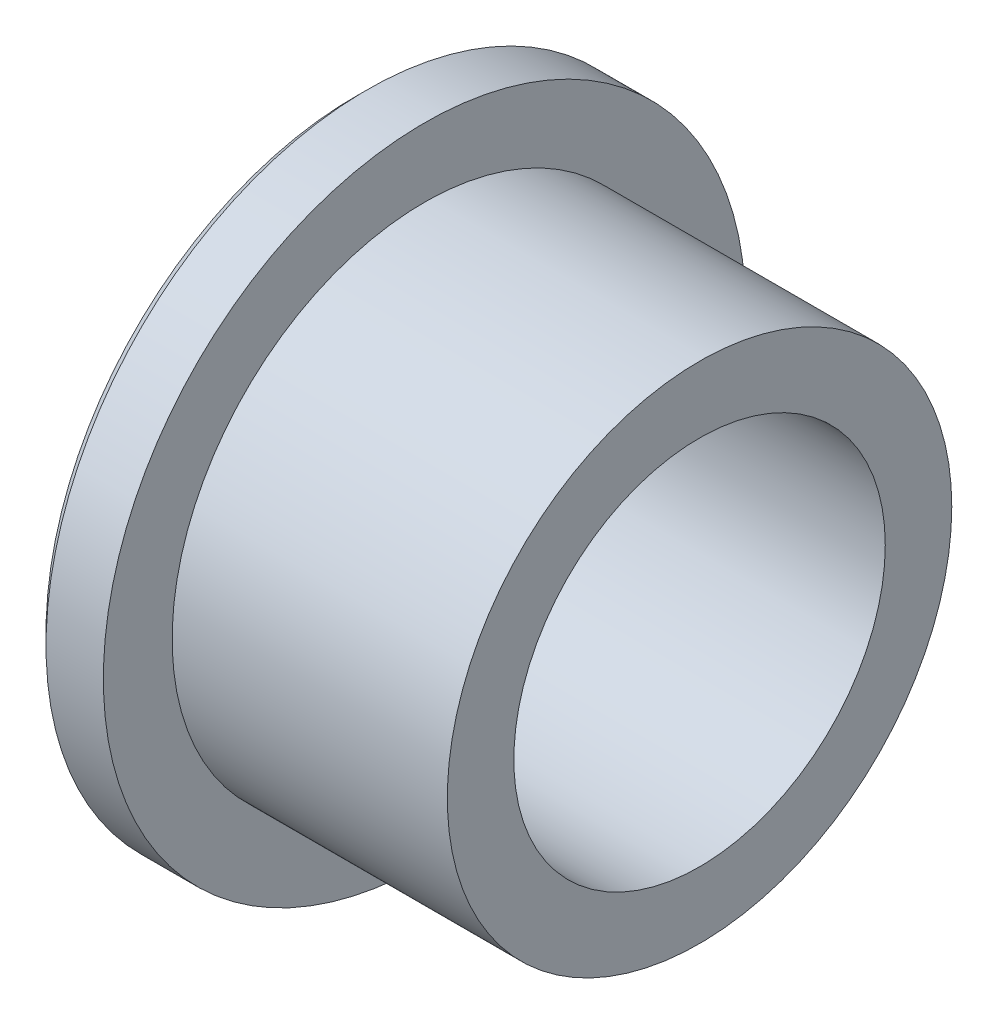
ISO-10303-21;
HEADER;
FILE_DESCRIPTION(('STEP AP214'),'2;1');
FILE_NAME('part.step','',(''),(''),'','','');
FILE_SCHEMA(('AUTOMOTIVE_DESIGN { 1 0 10303 214 1 1 1 1 }'));
ENDSEC;
DATA;
#1=APPLICATION_CONTEXT('core data for automotive mechanical design processes');
#2=APPLICATION_PROTOCOL_DEFINITION('international standard','automotive_design',2000,#1);
#3=PRODUCT_CONTEXT('',#1,'mechanical');
#4=PRODUCT('Part','Part','',(#3));
#5=PRODUCT_RELATED_PRODUCT_CATEGORY('part','',(#4));
#6=PRODUCT_DEFINITION_FORMATION('','',#4);
#7=PRODUCT_DEFINITION_CONTEXT('part definition',#1,'design');
#8=PRODUCT_DEFINITION('design','',#6,#7);
#9=PRODUCT_DEFINITION_SHAPE('','',#8);
#10=(LENGTH_UNIT() NAMED_UNIT(*) SI_UNIT(.MILLI.,.METRE.));
#11=(NAMED_UNIT(*) PLANE_ANGLE_UNIT() SI_UNIT($,.RADIAN.));
#12=(NAMED_UNIT(*) SI_UNIT($,.STERADIAN.) SOLID_ANGLE_UNIT());
#13=UNCERTAINTY_MEASURE_WITH_UNIT(LENGTH_MEASURE(1.E-05),#10,'distance_accuracy_value','');
#14=(GEOMETRIC_REPRESENTATION_CONTEXT(3) GLOBAL_UNCERTAINTY_ASSIGNED_CONTEXT((#13)) GLOBAL_UNIT_ASSIGNED_CONTEXT((#10,
#11,#12)) REPRESENTATION_CONTEXT('',''));
#15=CARTESIAN_POINT('',(0.,0.,0.));
#16=DIRECTION('',(0.,0.,1.));
#17=DIRECTION('',(1.,0.,0.));
#18=AXIS2_PLACEMENT_3D('',#15,#16,#17);
#19=CARTESIAN_POINT('',(3.,0.,0.));
#20=DIRECTION('',(1.,0.,0.));
#21=DIRECTION('',(0.,0.,-1.));
#22=AXIS2_PLACEMENT_3D('',#19,#20,#21);
#23=PLANE('',#22);
#24=CARTESIAN_POINT('',(3.,0.,0.));
#25=DIRECTION('',(1.,0.,0.));
#26=DIRECTION('',(0.,0.,-1.));
#27=AXIS2_PLACEMENT_3D('',#24,#25,#26);
#28=CIRCLE('',#27,14.);
#29=CARTESIAN_POINT('',(3.,0.,-14.));
#30=VERTEX_POINT('',#29);
#31=EDGE_CURVE('E53',#30,#30,#28,.T.);
#32=ORIENTED_EDGE('',*,*,#31,.T.);
#33=EDGE_LOOP('',(#32));
#34=FACE_BOUND('',#33,.T.);
#35=CARTESIAN_POINT('',(3.,0.,0.));
#36=DIRECTION('',(1.,0.,0.));
#37=DIRECTION('',(0.,0.,-1.));
#38=AXIS2_PLACEMENT_3D('',#35,#36,#37);
#39=CIRCLE('',#38,11.);
#40=CARTESIAN_POINT('',(3.,0.,-11.));
#41=VERTEX_POINT('',#40);
#42=EDGE_CURVE('E63',#41,#41,#39,.T.);
#43=ORIENTED_EDGE('',*,*,#42,.F.);
#44=EDGE_LOOP('',(#43));
#45=FACE_BOUND('',#44,.T.);
#46=ADVANCED_FACE('F42',(#34,#45),#23,.T.);
#47=CARTESIAN_POINT('',(0.,0.,0.));
#48=DIRECTION('',(1.,0.,0.));
#49=DIRECTION('',(0.,0.,-1.));
#50=AXIS2_PLACEMENT_3D('',#47,#48,#49);
#51=PLANE('',#50);
#52=CARTESIAN_POINT('',(0.,0.,0.));
#53=DIRECTION('',(1.,0.,0.));
#54=DIRECTION('',(0.,0.,-1.));
#55=AXIS2_PLACEMENT_3D('',#52,#53,#54);
#56=CIRCLE('',#55,13.5);
#57=CARTESIAN_POINT('',(0.,0.,-13.5));
#58=VERTEX_POINT('',#57);
#59=EDGE_CURVE('E12',#58,#58,#56,.F.);
#60=ORIENTED_EDGE('',*,*,#59,.T.);
#61=EDGE_LOOP('',(#60));
#62=FACE_BOUND('',#61,.T.);
#63=CARTESIAN_POINT('',(0.,0.,0.));
#64=DIRECTION('',(1.,0.,0.));
#65=DIRECTION('',(0.,0.,-1.));
#66=AXIS2_PLACEMENT_3D('',#63,#64,#65);
#67=CIRCLE('',#66,8.1);
#68=CARTESIAN_POINT('',(0.,0.,-8.1));
#69=VERTEX_POINT('',#68);
#70=EDGE_CURVE('E57',#69,#69,#67,.T.);
#71=ORIENTED_EDGE('',*,*,#70,.T.);
#72=EDGE_LOOP('',(#71));
#73=FACE_BOUND('',#72,.T.);
#74=ADVANCED_FACE('F89',(#62,#73),#51,.F.);
#75=CARTESIAN_POINT('',(3.,0.,0.));
#76=DIRECTION('',(-1.,0.,0.));
#77=DIRECTION('',(0.,0.,1.));
#78=AXIS2_PLACEMENT_3D('',#75,#76,#77);
#79=CYLINDRICAL_SURFACE('',#78,14.);
#80=CARTESIAN_POINT('',(0.499999999999999,0.,0.));
#81=DIRECTION('',(1.,0.,0.));
#82=DIRECTION('',(0.,0.,-1.));
#83=AXIS2_PLACEMENT_3D('',#80,#81,#82);
#84=CIRCLE('',#83,14.);
#85=CARTESIAN_POINT('',(0.499999999999999,0.,-14.));
#86=VERTEX_POINT('',#85);
#87=EDGE_CURVE('E49',#86,#86,#84,.T.);
#88=ORIENTED_EDGE('',*,*,#87,.T.);
#89=EDGE_LOOP('',(#88));
#90=FACE_BOUND('',#89,.T.);
#91=ORIENTED_EDGE('',*,*,#31,.F.);
#92=EDGE_LOOP('',(#91));
#93=FACE_BOUND('',#92,.T.);
#94=ADVANCED_FACE('F85',(#90,#93),#79,.T.);
#95=CARTESIAN_POINT('',(3.,0.,0.));
#96=DIRECTION('',(-1.,0.,0.));
#97=DIRECTION('',(0.,0.,1.));
#98=AXIS2_PLACEMENT_3D('',#95,#96,#97);
#99=CYLINDRICAL_SURFACE('',#98,8.1);
#100=ORIENTED_EDGE('',*,*,#70,.F.);
#101=EDGE_LOOP('',(#100));
#102=FACE_BOUND('',#101,.T.);
#103=CARTESIAN_POINT('',(15.,0.,0.));
#104=DIRECTION('',(1.,0.,0.));
#105=DIRECTION('',(0.,0.,-1.));
#106=AXIS2_PLACEMENT_3D('',#103,#104,#105);
#107=CIRCLE('',#106,8.1);
#108=CARTESIAN_POINT('',(15.,0.,-8.1));
#109=VERTEX_POINT('',#108);
#110=EDGE_CURVE('E66',#109,#109,#107,.T.);
#111=ORIENTED_EDGE('',*,*,#110,.T.);
#112=EDGE_LOOP('',(#111));
#113=FACE_BOUND('',#112,.T.);
#114=ADVANCED_FACE('F72',(#102,#113),#99,.F.);
#115=CARTESIAN_POINT('',(15.,0.,0.));
#116=DIRECTION('',(1.,0.,0.));
#117=DIRECTION('',(0.,0.,-1.));
#118=AXIS2_PLACEMENT_3D('',#115,#116,#117);
#119=PLANE('',#118);
#120=CARTESIAN_POINT('',(15.,0.,0.));
#121=DIRECTION('',(1.,0.,0.));
#122=DIRECTION('',(0.,0.,-1.));
#123=AXIS2_PLACEMENT_3D('',#120,#121,#122);
#124=CIRCLE('',#123,11.);
#125=CARTESIAN_POINT('',(15.,0.,-11.));
#126=VERTEX_POINT('',#125);
#127=EDGE_CURVE('E62',#126,#126,#124,.T.);
#128=ORIENTED_EDGE('',*,*,#127,.T.);
#129=EDGE_LOOP('',(#128));
#130=FACE_BOUND('',#129,.T.);
#131=ORIENTED_EDGE('',*,*,#110,.F.);
#132=EDGE_LOOP('',(#131));
#133=FACE_BOUND('',#132,.T.);
#134=ADVANCED_FACE('F74',(#130,#133),#119,.T.);
#135=CARTESIAN_POINT('',(15.,0.,0.));
#136=DIRECTION('',(-1.,0.,0.));
#137=DIRECTION('',(0.,0.,1.));
#138=AXIS2_PLACEMENT_3D('',#135,#136,#137);
#139=CYLINDRICAL_SURFACE('',#138,11.);
#140=ORIENTED_EDGE('',*,*,#127,.F.);
#141=EDGE_LOOP('',(#140));
#142=FACE_BOUND('',#141,.T.);
#143=ORIENTED_EDGE('',*,*,#42,.T.);
#144=EDGE_LOOP('',(#143));
#145=FACE_BOUND('',#144,.T.);
#146=ADVANCED_FACE('F76',(#142,#145),#139,.T.);
#147=CARTESIAN_POINT('',(0.499999999999999,0.,0.));
#148=DIRECTION('',(1.,0.,0.));
#149=DIRECTION('',(0.,0.,-1.));
#150=AXIS2_PLACEMENT_3D('',#147,#148,#149);
#151=CONICAL_SURFACE('',#150,14.,0.785398163397448);
#152=ORIENTED_EDGE('',*,*,#59,.F.);
#153=EDGE_LOOP('',(#152));
#154=FACE_BOUND('',#153,.T.);
#155=ORIENTED_EDGE('',*,*,#87,.F.);
#156=EDGE_LOOP('',(#155));
#157=FACE_BOUND('',#156,.T.);
#158=ADVANCED_FACE('F44',(#154,#157),#151,.T.);
#159=CLOSED_SHELL('',(#46,#74,#94,#114,#134,#146,#158));
#160=MANIFOLD_SOLID_BREP('B2',#159);
#161=ADVANCED_BREP_SHAPE_REPRESENTATION('',(#18,#160),#14);
#162=SHAPE_DEFINITION_REPRESENTATION(#9,#161);
ENDSEC;
END-ISO-10303-21;
